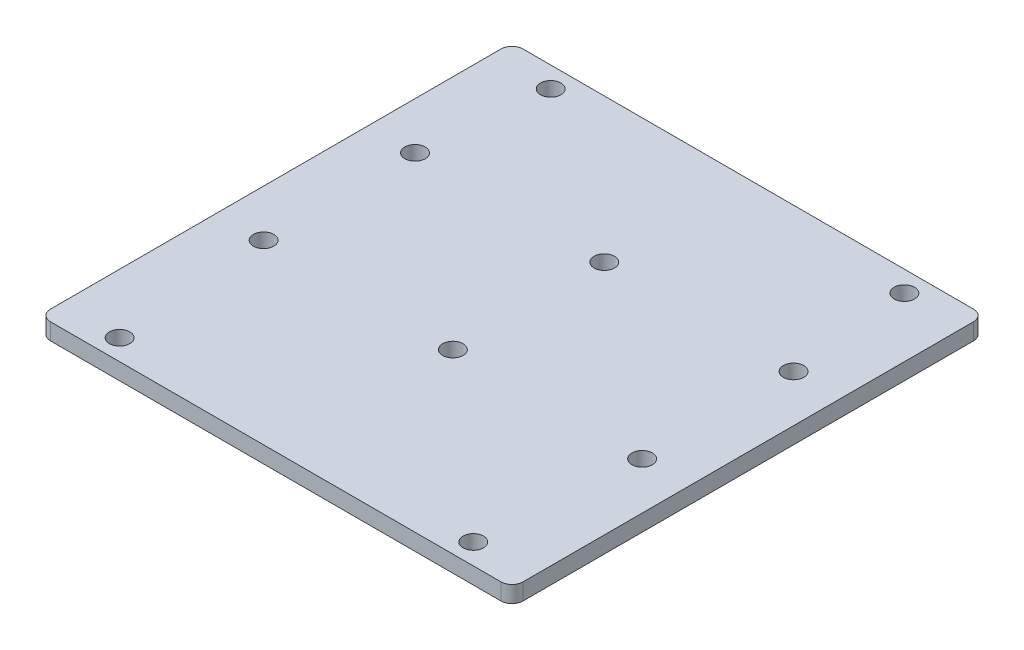
ISO-10303-21;
HEADER;
FILE_DESCRIPTION(('STEP AP214'),'2;1');
FILE_NAME('part.step','',(''),(''),'','','');
FILE_SCHEMA(('AUTOMOTIVE_DESIGN { 1 0 10303 214 1 1 1 1 }'));
ENDSEC;
DATA;
#1=APPLICATION_CONTEXT('core data for automotive mechanical design processes');
#2=APPLICATION_PROTOCOL_DEFINITION('international standard','automotive_design',2000,#1);
#3=PRODUCT_CONTEXT('',#1,'mechanical');
#4=PRODUCT('Part','Part','',(#3));
#5=PRODUCT_RELATED_PRODUCT_CATEGORY('part','',(#4));
#6=PRODUCT_DEFINITION_FORMATION('','',#4);
#7=PRODUCT_DEFINITION_CONTEXT('part definition',#1,'design');
#8=PRODUCT_DEFINITION('design','',#6,#7);
#9=PRODUCT_DEFINITION_SHAPE('','',#8);
#10=(LENGTH_UNIT() NAMED_UNIT(*) SI_UNIT(.MILLI.,.METRE.));
#11=(NAMED_UNIT(*) PLANE_ANGLE_UNIT() SI_UNIT($,.RADIAN.));
#12=(NAMED_UNIT(*) SI_UNIT($,.STERADIAN.) SOLID_ANGLE_UNIT());
#13=UNCERTAINTY_MEASURE_WITH_UNIT(LENGTH_MEASURE(1.E-05),#10,'distance_accuracy_value','');
#14=(GEOMETRIC_REPRESENTATION_CONTEXT(3) GLOBAL_UNCERTAINTY_ASSIGNED_CONTEXT((#13)) GLOBAL_UNIT_ASSIGNED_CONTEXT((#10,
#11,#12)) REPRESENTATION_CONTEXT('',''));
#15=CARTESIAN_POINT('',(0.,0.,0.));
#16=DIRECTION('',(0.,0.,1.));
#17=DIRECTION('',(1.,0.,0.));
#18=AXIS2_PLACEMENT_3D('',#15,#16,#17);
#19=CARTESIAN_POINT('',(-42.75,3.,42.75));
#20=DIRECTION('',(1.,0.,0.));
#21=DIRECTION('',(0.,0.,-1.));
#22=AXIS2_PLACEMENT_3D('',#19,#20,#21);
#23=PLANE('',#22);
#24=DIRECTION('',(0.,0.,1.));
#25=VECTOR('',#24,1.);
#26=CARTESIAN_POINT('',(-42.75,3.,42.75));
#27=LINE('',#26,#25);
#28=CARTESIAN_POINT('',(-42.75,3.,-40.75));
#29=VERTEX_POINT('',#28);
#30=CARTESIAN_POINT('',(-42.75,3.,40.75));
#31=VERTEX_POINT('',#30);
#32=EDGE_CURVE('E122',#29,#31,#27,.T.);
#33=ORIENTED_EDGE('',*,*,#32,.F.);
#34=DIRECTION('',(0.,-1.,0.));
#35=VECTOR('',#34,1.);
#36=CARTESIAN_POINT('',(-42.75,3.,-40.75));
#37=LINE('',#36,#35);
#38=CARTESIAN_POINT('',(-42.75,0.,-40.75));
#39=VERTEX_POINT('',#38);
#40=EDGE_CURVE('E107',#29,#39,#37,.T.);
#41=ORIENTED_EDGE('',*,*,#40,.T.);
#42=DIRECTION('',(0.,0.,1.));
#43=VECTOR('',#42,1.);
#44=CARTESIAN_POINT('',(-42.75,0.,42.75));
#45=LINE('',#44,#43);
#46=CARTESIAN_POINT('',(-42.75,0.,40.75));
#47=VERTEX_POINT('',#46);
#48=EDGE_CURVE('E119',#39,#47,#45,.T.);
#49=ORIENTED_EDGE('',*,*,#48,.T.);
#50=DIRECTION('',(0.,-1.,0.));
#51=VECTOR('',#50,1.);
#52=CARTESIAN_POINT('',(-42.75,3.,40.75));
#53=LINE('',#52,#51);
#54=EDGE_CURVE('E124',#47,#31,#53,.F.);
#55=ORIENTED_EDGE('',*,*,#54,.T.);
#56=EDGE_LOOP('',(#33,#41,#49,#55));
#57=FACE_BOUND('',#56,.T.);
#58=ADVANCED_FACE('F36',(#57),#23,.F.);
#59=CARTESIAN_POINT('',(42.75,3.,42.75));
#60=DIRECTION('',(0.,0.,-1.));
#61=DIRECTION('',(-1.,0.,0.));
#62=AXIS2_PLACEMENT_3D('',#59,#60,#61);
#63=PLANE('',#62);
#64=DIRECTION('',(1.,0.,0.));
#65=VECTOR('',#64,1.);
#66=CARTESIAN_POINT('',(42.75,3.,42.75));
#67=LINE('',#66,#65);
#68=CARTESIAN_POINT('',(-40.75,3.,42.75));
#69=VERTEX_POINT('',#68);
#70=CARTESIAN_POINT('',(40.75,3.,42.75));
#71=VERTEX_POINT('',#70);
#72=EDGE_CURVE('E166',#69,#71,#67,.T.);
#73=ORIENTED_EDGE('',*,*,#72,.F.);
#74=DIRECTION('',(0.,-1.,0.));
#75=VECTOR('',#74,1.);
#76=CARTESIAN_POINT('',(-40.75,3.,42.75));
#77=LINE('',#76,#75);
#78=CARTESIAN_POINT('',(-40.75,0.,42.75));
#79=VERTEX_POINT('',#78);
#80=EDGE_CURVE('E11',#69,#79,#77,.T.);
#81=ORIENTED_EDGE('',*,*,#80,.T.);
#82=DIRECTION('',(1.,0.,0.));
#83=VECTOR('',#82,1.);
#84=CARTESIAN_POINT('',(42.75,0.,42.75));
#85=LINE('',#84,#83);
#86=CARTESIAN_POINT('',(40.75,0.,42.75));
#87=VERTEX_POINT('',#86);
#88=EDGE_CURVE('E129',#79,#87,#85,.T.);
#89=ORIENTED_EDGE('',*,*,#88,.T.);
#90=DIRECTION('',(0.,-1.,0.));
#91=VECTOR('',#90,1.);
#92=CARTESIAN_POINT('',(40.75,3.,42.75));
#93=LINE('',#92,#91);
#94=EDGE_CURVE('E44',#87,#71,#93,.F.);
#95=ORIENTED_EDGE('',*,*,#94,.T.);
#96=EDGE_LOOP('',(#73,#81,#89,#95));
#97=FACE_BOUND('',#96,.T.);
#98=ADVANCED_FACE('F165',(#97),#63,.F.);
#99=CARTESIAN_POINT('',(42.75,3.,42.75));
#100=DIRECTION('',(-1.,0.,0.));
#101=DIRECTION('',(0.,0.,1.));
#102=AXIS2_PLACEMENT_3D('',#99,#100,#101);
#103=PLANE('',#102);
#104=DIRECTION('',(0.,0.,-1.));
#105=VECTOR('',#104,1.);
#106=CARTESIAN_POINT('',(42.75,0.,42.75));
#107=LINE('',#106,#105);
#108=CARTESIAN_POINT('',(42.75,0.,40.75));
#109=VERTEX_POINT('',#108);
#110=CARTESIAN_POINT('',(42.75,0.,-40.75));
#111=VERTEX_POINT('',#110);
#112=EDGE_CURVE('E133',#109,#111,#107,.T.);
#113=ORIENTED_EDGE('',*,*,#112,.T.);
#114=DIRECTION('',(0.,-1.,0.));
#115=VECTOR('',#114,1.);
#116=CARTESIAN_POINT('',(42.75,3.,-40.75));
#117=LINE('',#116,#115);
#118=CARTESIAN_POINT('',(42.75,3.,-40.75));
#119=VERTEX_POINT('',#118);
#120=EDGE_CURVE('E51',#111,#119,#117,.F.);
#121=ORIENTED_EDGE('',*,*,#120,.T.);
#122=DIRECTION('',(0.,0.,-1.));
#123=VECTOR('',#122,1.);
#124=CARTESIAN_POINT('',(42.75,3.,42.75));
#125=LINE('',#124,#123);
#126=CARTESIAN_POINT('',(42.75,3.,40.75));
#127=VERTEX_POINT('',#126);
#128=EDGE_CURVE('E172',#127,#119,#125,.T.);
#129=ORIENTED_EDGE('',*,*,#128,.F.);
#130=DIRECTION('',(0.,-1.,0.));
#131=VECTOR('',#130,1.);
#132=CARTESIAN_POINT('',(42.75,3.,40.75));
#133=LINE('',#132,#131);
#134=EDGE_CURVE('E159',#127,#109,#133,.T.);
#135=ORIENTED_EDGE('',*,*,#134,.T.);
#136=EDGE_LOOP('',(#113,#121,#129,#135));
#137=FACE_BOUND('',#136,.T.);
#138=ADVANCED_FACE('F176',(#137),#103,.F.);
#139=CARTESIAN_POINT('',(42.75,3.,-42.75));
#140=DIRECTION('',(0.,0.,1.));
#141=DIRECTION('',(1.,0.,0.));
#142=AXIS2_PLACEMENT_3D('',#139,#140,#141);
#143=PLANE('',#142);
#144=DIRECTION('',(-1.,0.,0.));
#145=VECTOR('',#144,1.);
#146=CARTESIAN_POINT('',(42.75,0.,-42.75));
#147=LINE('',#146,#145);
#148=CARTESIAN_POINT('',(40.75,0.,-42.75));
#149=VERTEX_POINT('',#148);
#150=CARTESIAN_POINT('',(-40.75,0.,-42.75));
#151=VERTEX_POINT('',#150);
#152=EDGE_CURVE('E143',#149,#151,#147,.T.);
#153=ORIENTED_EDGE('',*,*,#152,.T.);
#154=DIRECTION('',(0.,-1.,0.));
#155=VECTOR('',#154,1.);
#156=CARTESIAN_POINT('',(-40.75,3.,-42.75));
#157=LINE('',#156,#155);
#158=CARTESIAN_POINT('',(-40.75,3.,-42.75));
#159=VERTEX_POINT('',#158);
#160=EDGE_CURVE('E108',#151,#159,#157,.F.);
#161=ORIENTED_EDGE('',*,*,#160,.T.);
#162=DIRECTION('',(-1.,0.,0.));
#163=VECTOR('',#162,1.);
#164=CARTESIAN_POINT('',(42.75,3.,-42.75));
#165=LINE('',#164,#163);
#166=CARTESIAN_POINT('',(40.75,3.,-42.75));
#167=VERTEX_POINT('',#166);
#168=EDGE_CURVE('E139',#167,#159,#165,.T.);
#169=ORIENTED_EDGE('',*,*,#168,.F.);
#170=DIRECTION('',(0.,-1.,0.));
#171=VECTOR('',#170,1.);
#172=CARTESIAN_POINT('',(40.75,3.,-42.75));
#173=LINE('',#172,#171);
#174=EDGE_CURVE('E113',#167,#149,#173,.T.);
#175=ORIENTED_EDGE('',*,*,#174,.T.);
#176=EDGE_LOOP('',(#153,#161,#169,#175));
#177=FACE_BOUND('',#176,.T.);
#178=ADVANCED_FACE('F183',(#177),#143,.F.);
#179=CARTESIAN_POINT('',(0.,3.,0.));
#180=DIRECTION('',(0.,1.,0.));
#181=DIRECTION('',(0.,0.,1.));
#182=AXIS2_PLACEMENT_3D('',#179,#180,#181);
#183=PLANE('',#182);
#184=CARTESIAN_POINT('',(0.,3.,-16.7));
#185=DIRECTION('',(0.,1.,0.));
#186=DIRECTION('',(0.,0.,1.));
#187=AXIS2_PLACEMENT_3D('',#184,#185,#186);
#188=CIRCLE('',#187,1.85);
#189=CARTESIAN_POINT('',(0.,3.,-14.85));
#190=VERTEX_POINT('',#189);
#191=EDGE_CURVE('E206',#190,#190,#188,.T.);
#192=ORIENTED_EDGE('',*,*,#191,.F.);
#193=EDGE_LOOP('',(#192));
#194=FACE_BOUND('',#193,.T.);
#195=CARTESIAN_POINT('',(34.2499999999999,3.,-16.7));
#196=DIRECTION('',(0.,1.,0.));
#197=DIRECTION('',(0.,0.,1.));
#198=AXIS2_PLACEMENT_3D('',#195,#196,#197);
#199=CIRCLE('',#198,1.85);
#200=CARTESIAN_POINT('',(34.2499999999999,3.,-14.85));
#201=VERTEX_POINT('',#200);
#202=EDGE_CURVE('E209',#201,#201,#199,.T.);
#203=ORIENTED_EDGE('',*,*,#202,.F.);
#204=EDGE_LOOP('',(#203));
#205=FACE_BOUND('',#204,.T.);
#206=CARTESIAN_POINT('',(0.,3.,10.7));
#207=DIRECTION('',(0.,1.,0.));
#208=DIRECTION('',(0.,0.,1.));
#209=AXIS2_PLACEMENT_3D('',#206,#207,#208);
#210=CIRCLE('',#209,1.85);
#211=CARTESIAN_POINT('',(0.,3.,12.55));
#212=VERTEX_POINT('',#211);
#213=EDGE_CURVE('E212',#212,#212,#210,.T.);
#214=ORIENTED_EDGE('',*,*,#213,.F.);
#215=EDGE_LOOP('',(#214));
#216=FACE_BOUND('',#215,.T.);
#217=CARTESIAN_POINT('',(-34.25,3.,10.7));
#218=DIRECTION('',(0.,1.,0.));
#219=DIRECTION('',(0.,0.,1.));
#220=AXIS2_PLACEMENT_3D('',#217,#218,#219);
#221=CIRCLE('',#220,1.85);
#222=CARTESIAN_POINT('',(-34.25,3.,12.55));
#223=VERTEX_POINT('',#222);
#224=EDGE_CURVE('E215',#223,#223,#221,.T.);
#225=ORIENTED_EDGE('',*,*,#224,.F.);
#226=EDGE_LOOP('',(#225));
#227=FACE_BOUND('',#226,.T.);
#228=CARTESIAN_POINT('',(34.2499999999999,3.,10.7));
#229=DIRECTION('',(0.,1.,0.));
#230=DIRECTION('',(0.,0.,1.));
#231=AXIS2_PLACEMENT_3D('',#228,#229,#230);
#232=CIRCLE('',#231,1.85);
#233=CARTESIAN_POINT('',(34.2499999999999,3.,12.55));
#234=VERTEX_POINT('',#233);
#235=EDGE_CURVE('E218',#234,#234,#232,.T.);
#236=ORIENTED_EDGE('',*,*,#235,.F.);
#237=EDGE_LOOP('',(#236));
#238=FACE_BOUND('',#237,.T.);
#239=CARTESIAN_POINT('',(-34.25,3.,-16.6999999999999));
#240=DIRECTION('',(0.,1.,0.));
#241=DIRECTION('',(0.,0.,1.));
#242=AXIS2_PLACEMENT_3D('',#239,#240,#241);
#243=CIRCLE('',#242,1.85);
#244=CARTESIAN_POINT('',(-34.25,3.,-14.8499999999999));
#245=VERTEX_POINT('',#244);
#246=EDGE_CURVE('E221',#245,#245,#243,.T.);
#247=ORIENTED_EDGE('',*,*,#246,.F.);
#248=EDGE_LOOP('',(#247));
#249=FACE_BOUND('',#248,.T.);
#250=CARTESIAN_POINT('',(31.9999999999999,3.,38.9999999999999));
#251=DIRECTION('',(0.,1.,0.));
#252=DIRECTION('',(0.,0.,1.));
#253=AXIS2_PLACEMENT_3D('',#250,#251,#252);
#254=CIRCLE('',#253,1.85);
#255=CARTESIAN_POINT('',(31.9999999999999,3.,40.8499999999999));
#256=VERTEX_POINT('',#255);
#257=EDGE_CURVE('E130',#256,#256,#254,.T.);
#258=ORIENTED_EDGE('',*,*,#257,.F.);
#259=EDGE_LOOP('',(#258));
#260=FACE_BOUND('',#259,.T.);
#261=CARTESIAN_POINT('',(-32.,3.,-39.));
#262=DIRECTION('',(0.,1.,0.));
#263=DIRECTION('',(0.,0.,1.));
#264=AXIS2_PLACEMENT_3D('',#261,#262,#263);
#265=CIRCLE('',#264,1.85);
#266=CARTESIAN_POINT('',(-32.,3.,-37.15));
#267=VERTEX_POINT('',#266);
#268=EDGE_CURVE('E136',#267,#267,#265,.T.);
#269=ORIENTED_EDGE('',*,*,#268,.F.);
#270=EDGE_LOOP('',(#269));
#271=FACE_BOUND('',#270,.T.);
#272=CARTESIAN_POINT('',(32.,3.,-39.));
#273=DIRECTION('',(0.,1.,0.));
#274=DIRECTION('',(0.,0.,1.));
#275=AXIS2_PLACEMENT_3D('',#272,#273,#274);
#276=CIRCLE('',#275,1.85);
#277=CARTESIAN_POINT('',(32.,3.,-37.15));
#278=VERTEX_POINT('',#277);
#279=EDGE_CURVE('E188',#278,#278,#276,.T.);
#280=ORIENTED_EDGE('',*,*,#279,.F.);
#281=EDGE_LOOP('',(#280));
#282=FACE_BOUND('',#281,.T.);
#283=CARTESIAN_POINT('',(-32.0000000000001,3.,39.));
#284=DIRECTION('',(0.,1.,0.));
#285=DIRECTION('',(0.,0.,1.));
#286=AXIS2_PLACEMENT_3D('',#283,#284,#285);
#287=CIRCLE('',#286,1.85);
#288=CARTESIAN_POINT('',(-32.0000000000001,3.,40.85));
#289=VERTEX_POINT('',#288);
#290=EDGE_CURVE('E191',#289,#289,#287,.T.);
#291=ORIENTED_EDGE('',*,*,#290,.F.);
#292=EDGE_LOOP('',(#291));
#293=FACE_BOUND('',#292,.T.);
#294=ORIENTED_EDGE('',*,*,#168,.T.);
#295=CARTESIAN_POINT('',(-40.75,3.,-40.75));
#296=DIRECTION('',(0.,1.,0.));
#297=DIRECTION('',(0.,0.,1.));
#298=AXIS2_PLACEMENT_3D('',#295,#296,#297);
#299=CIRCLE('',#298,2.);
#300=EDGE_CURVE('E157',#159,#29,#299,.T.);
#301=ORIENTED_EDGE('',*,*,#300,.T.);
#302=ORIENTED_EDGE('',*,*,#32,.T.);
#303=CARTESIAN_POINT('',(-40.75,3.,40.75));
#304=DIRECTION('',(0.,1.,0.));
#305=DIRECTION('',(0.,0.,1.));
#306=AXIS2_PLACEMENT_3D('',#303,#304,#305);
#307=CIRCLE('',#306,2.);
#308=EDGE_CURVE('E153',#31,#69,#307,.T.);
#309=ORIENTED_EDGE('',*,*,#308,.T.);
#310=ORIENTED_EDGE('',*,*,#72,.T.);
#311=CARTESIAN_POINT('',(40.75,3.,40.75));
#312=DIRECTION('',(0.,1.,0.));
#313=DIRECTION('',(0.,0.,1.));
#314=AXIS2_PLACEMENT_3D('',#311,#312,#313);
#315=CIRCLE('',#314,2.);
#316=EDGE_CURVE('E58',#71,#127,#315,.T.);
#317=ORIENTED_EDGE('',*,*,#316,.T.);
#318=ORIENTED_EDGE('',*,*,#128,.T.);
#319=CARTESIAN_POINT('',(40.75,3.,-40.75));
#320=DIRECTION('',(0.,1.,0.));
#321=DIRECTION('',(0.,0.,1.));
#322=AXIS2_PLACEMENT_3D('',#319,#320,#321);
#323=CIRCLE('',#322,2.);
#324=EDGE_CURVE('E155',#119,#167,#323,.T.);
#325=ORIENTED_EDGE('',*,*,#324,.T.);
#326=EDGE_LOOP('',(#294,#301,#302,#309,#310,#317,#318,#325));
#327=FACE_BOUND('',#326,.T.);
#328=ADVANCED_FACE('F170',(#194,#205,#216,#227,#238,#249,#260,#271,#282,#293,#327),#183,.T.);
#329=CARTESIAN_POINT('',(0.,0.,0.));
#330=DIRECTION('',(0.,1.,0.));
#331=DIRECTION('',(0.,0.,1.));
#332=AXIS2_PLACEMENT_3D('',#329,#330,#331);
#333=PLANE('',#332);
#334=CARTESIAN_POINT('',(0.,0.,-16.7));
#335=DIRECTION('',(0.,-1.,0.));
#336=DIRECTION('',(0.,0.,-1.));
#337=AXIS2_PLACEMENT_3D('',#334,#335,#336);
#338=CIRCLE('',#337,1.85);
#339=CARTESIAN_POINT('',(0.,0.,-18.55));
#340=VERTEX_POINT('',#339);
#341=EDGE_CURVE('E227',#340,#340,#338,.T.);
#342=ORIENTED_EDGE('',*,*,#341,.F.);
#343=EDGE_LOOP('',(#342));
#344=FACE_BOUND('',#343,.T.);
#345=CARTESIAN_POINT('',(34.2499999999999,0.,-16.7));
#346=DIRECTION('',(0.,-1.,0.));
#347=DIRECTION('',(0.,0.,-1.));
#348=AXIS2_PLACEMENT_3D('',#345,#346,#347);
#349=CIRCLE('',#348,1.85);
#350=CARTESIAN_POINT('',(34.2499999999999,0.,-18.55));
#351=VERTEX_POINT('',#350);
#352=EDGE_CURVE('E235',#351,#351,#349,.T.);
#353=ORIENTED_EDGE('',*,*,#352,.F.);
#354=EDGE_LOOP('',(#353));
#355=FACE_BOUND('',#354,.T.);
#356=CARTESIAN_POINT('',(0.,0.,10.7));
#357=DIRECTION('',(0.,-1.,0.));
#358=DIRECTION('',(0.,0.,-1.));
#359=AXIS2_PLACEMENT_3D('',#356,#357,#358);
#360=CIRCLE('',#359,1.85);
#361=CARTESIAN_POINT('',(0.,0.,8.85000000000004));
#362=VERTEX_POINT('',#361);
#363=EDGE_CURVE('E231',#362,#362,#360,.T.);
#364=ORIENTED_EDGE('',*,*,#363,.F.);
#365=EDGE_LOOP('',(#364));
#366=FACE_BOUND('',#365,.T.);
#367=CARTESIAN_POINT('',(-34.25,0.,10.7));
#368=DIRECTION('',(0.,-1.,0.));
#369=DIRECTION('',(0.,0.,-1.));
#370=AXIS2_PLACEMENT_3D('',#367,#368,#369);
#371=CIRCLE('',#370,1.85);
#372=CARTESIAN_POINT('',(-34.25,0.,8.85000000000005));
#373=VERTEX_POINT('',#372);
#374=EDGE_CURVE('E228',#373,#373,#371,.T.);
#375=ORIENTED_EDGE('',*,*,#374,.F.);
#376=EDGE_LOOP('',(#375));
#377=FACE_BOUND('',#376,.T.);
#378=CARTESIAN_POINT('',(34.2499999999999,0.,10.7));
#379=DIRECTION('',(0.,-1.,0.));
#380=DIRECTION('',(0.,0.,-1.));
#381=AXIS2_PLACEMENT_3D('',#378,#379,#380);
#382=CIRCLE('',#381,1.85);
#383=CARTESIAN_POINT('',(34.2499999999999,0.,8.85000000000002));
#384=VERTEX_POINT('',#383);
#385=EDGE_CURVE('E232',#384,#384,#382,.T.);
#386=ORIENTED_EDGE('',*,*,#385,.F.);
#387=EDGE_LOOP('',(#386));
#388=FACE_BOUND('',#387,.T.);
#389=CARTESIAN_POINT('',(-34.25,0.,-16.6999999999999));
#390=DIRECTION('',(0.,-1.,0.));
#391=DIRECTION('',(0.,0.,-1.));
#392=AXIS2_PLACEMENT_3D('',#389,#390,#391);
#393=CIRCLE('',#392,1.85);
#394=CARTESIAN_POINT('',(-34.25,0.,-18.5499999999999));
#395=VERTEX_POINT('',#394);
#396=EDGE_CURVE('E224',#395,#395,#393,.T.);
#397=ORIENTED_EDGE('',*,*,#396,.F.);
#398=EDGE_LOOP('',(#397));
#399=FACE_BOUND('',#398,.T.);
#400=CARTESIAN_POINT('',(31.9999999999999,0.,38.9999999999999));
#401=DIRECTION('',(0.,-1.,0.));
#402=DIRECTION('',(0.,0.,-1.));
#403=AXIS2_PLACEMENT_3D('',#400,#401,#402);
#404=CIRCLE('',#403,1.85);
#405=CARTESIAN_POINT('',(31.9999999999999,0.,37.1499999999999));
#406=VERTEX_POINT('',#405);
#407=EDGE_CURVE('E197',#406,#406,#404,.T.);
#408=ORIENTED_EDGE('',*,*,#407,.F.);
#409=EDGE_LOOP('',(#408));
#410=FACE_BOUND('',#409,.T.);
#411=CARTESIAN_POINT('',(-32.,0.,-39.));
#412=DIRECTION('',(0.,-1.,0.));
#413=DIRECTION('',(0.,0.,-1.));
#414=AXIS2_PLACEMENT_3D('',#411,#412,#413);
#415=CIRCLE('',#414,1.85);
#416=CARTESIAN_POINT('',(-32.,0.,-40.85));
#417=VERTEX_POINT('',#416);
#418=EDGE_CURVE('E198',#417,#417,#415,.T.);
#419=ORIENTED_EDGE('',*,*,#418,.F.);
#420=EDGE_LOOP('',(#419));
#421=FACE_BOUND('',#420,.T.);
#422=CARTESIAN_POINT('',(32.,0.,-39.));
#423=DIRECTION('',(0.,-1.,0.));
#424=DIRECTION('',(0.,0.,-1.));
#425=AXIS2_PLACEMENT_3D('',#422,#423,#424);
#426=CIRCLE('',#425,1.85);
#427=CARTESIAN_POINT('',(32.,0.,-40.85));
#428=VERTEX_POINT('',#427);
#429=EDGE_CURVE('E201',#428,#428,#426,.T.);
#430=ORIENTED_EDGE('',*,*,#429,.F.);
#431=EDGE_LOOP('',(#430));
#432=FACE_BOUND('',#431,.T.);
#433=CARTESIAN_POINT('',(-32.0000000000001,0.,39.));
#434=DIRECTION('',(0.,-1.,0.));
#435=DIRECTION('',(0.,0.,-1.));
#436=AXIS2_PLACEMENT_3D('',#433,#434,#435);
#437=CIRCLE('',#436,1.85);
#438=CARTESIAN_POINT('',(-32.0000000000001,0.,37.15));
#439=VERTEX_POINT('',#438);
#440=EDGE_CURVE('E194',#439,#439,#437,.T.);
#441=ORIENTED_EDGE('',*,*,#440,.F.);
#442=EDGE_LOOP('',(#441));
#443=FACE_BOUND('',#442,.T.);
#444=ORIENTED_EDGE('',*,*,#48,.F.);
#445=CARTESIAN_POINT('',(-40.75,0.,-40.75));
#446=DIRECTION('',(0.,1.,0.));
#447=DIRECTION('',(0.,0.,1.));
#448=AXIS2_PLACEMENT_3D('',#445,#446,#447);
#449=CIRCLE('',#448,2.);
#450=EDGE_CURVE('E103',#39,#151,#449,.F.);
#451=ORIENTED_EDGE('',*,*,#450,.T.);
#452=ORIENTED_EDGE('',*,*,#152,.F.);
#453=CARTESIAN_POINT('',(40.75,0.,-40.75));
#454=DIRECTION('',(0.,1.,0.));
#455=DIRECTION('',(0.,0.,1.));
#456=AXIS2_PLACEMENT_3D('',#453,#454,#455);
#457=CIRCLE('',#456,2.);
#458=EDGE_CURVE('E114',#149,#111,#457,.F.);
#459=ORIENTED_EDGE('',*,*,#458,.T.);
#460=ORIENTED_EDGE('',*,*,#112,.F.);
#461=CARTESIAN_POINT('',(40.75,0.,40.75));
#462=DIRECTION('',(0.,1.,0.));
#463=DIRECTION('',(0.,0.,1.));
#464=AXIS2_PLACEMENT_3D('',#461,#462,#463);
#465=CIRCLE('',#464,2.);
#466=EDGE_CURVE('E123',#109,#87,#465,.F.);
#467=ORIENTED_EDGE('',*,*,#466,.T.);
#468=ORIENTED_EDGE('',*,*,#88,.F.);
#469=CARTESIAN_POINT('',(-40.75,0.,40.75));
#470=DIRECTION('',(0.,1.,0.));
#471=DIRECTION('',(0.,0.,1.));
#472=AXIS2_PLACEMENT_3D('',#469,#470,#471);
#473=CIRCLE('',#472,2.);
#474=EDGE_CURVE('E128',#79,#47,#473,.F.);
#475=ORIENTED_EDGE('',*,*,#474,.T.);
#476=EDGE_LOOP('',(#444,#451,#452,#459,#460,#467,#468,#475));
#477=FACE_BOUND('',#476,.T.);
#478=ADVANCED_FACE('F126',(#344,#355,#366,#377,#388,#399,#410,#421,#432,#443,#477),#333,.F.);
#479=CARTESIAN_POINT('',(-40.75,3.,-40.75));
#480=DIRECTION('',(0.,-1.,0.));
#481=DIRECTION('',(0.,0.,-1.));
#482=AXIS2_PLACEMENT_3D('',#479,#480,#481);
#483=CYLINDRICAL_SURFACE('',#482,2.);
#484=ORIENTED_EDGE('',*,*,#300,.F.);
#485=ORIENTED_EDGE('',*,*,#160,.F.);
#486=ORIENTED_EDGE('',*,*,#450,.F.);
#487=ORIENTED_EDGE('',*,*,#40,.F.);
#488=EDGE_LOOP('',(#484,#485,#486,#487));
#489=FACE_BOUND('',#488,.T.);
#490=ADVANCED_FACE('F106',(#489),#483,.T.);
#491=CARTESIAN_POINT('',(40.75,3.,-40.75));
#492=DIRECTION('',(0.,-1.,0.));
#493=DIRECTION('',(0.,0.,-1.));
#494=AXIS2_PLACEMENT_3D('',#491,#492,#493);
#495=CYLINDRICAL_SURFACE('',#494,2.);
#496=ORIENTED_EDGE('',*,*,#324,.F.);
#497=ORIENTED_EDGE('',*,*,#120,.F.);
#498=ORIENTED_EDGE('',*,*,#458,.F.);
#499=ORIENTED_EDGE('',*,*,#174,.F.);
#500=EDGE_LOOP('',(#496,#497,#498,#499));
#501=FACE_BOUND('',#500,.T.);
#502=ADVANCED_FACE('F180',(#501),#495,.T.);
#503=CARTESIAN_POINT('',(-40.75,3.,40.75));
#504=DIRECTION('',(0.,-1.,0.));
#505=DIRECTION('',(0.,0.,-1.));
#506=AXIS2_PLACEMENT_3D('',#503,#504,#505);
#507=CYLINDRICAL_SURFACE('',#506,2.);
#508=ORIENTED_EDGE('',*,*,#308,.F.);
#509=ORIENTED_EDGE('',*,*,#54,.F.);
#510=ORIENTED_EDGE('',*,*,#474,.F.);
#511=ORIENTED_EDGE('',*,*,#80,.F.);
#512=EDGE_LOOP('',(#508,#509,#510,#511));
#513=FACE_BOUND('',#512,.T.);
#514=ADVANCED_FACE('F271',(#513),#507,.T.);
#515=CARTESIAN_POINT('',(40.75,3.,40.75));
#516=DIRECTION('',(0.,-1.,0.));
#517=DIRECTION('',(0.,0.,-1.));
#518=AXIS2_PLACEMENT_3D('',#515,#516,#517);
#519=CYLINDRICAL_SURFACE('',#518,2.);
#520=ORIENTED_EDGE('',*,*,#316,.F.);
#521=ORIENTED_EDGE('',*,*,#94,.F.);
#522=ORIENTED_EDGE('',*,*,#466,.F.);
#523=ORIENTED_EDGE('',*,*,#134,.F.);
#524=EDGE_LOOP('',(#520,#521,#522,#523));
#525=FACE_BOUND('',#524,.T.);
#526=ADVANCED_FACE('F38',(#525),#519,.T.);
#527=CARTESIAN_POINT('',(-32.0000000000001,10.,39.));
#528=DIRECTION('',(0.,-1.,0.));
#529=DIRECTION('',(0.,0.,-1.));
#530=AXIS2_PLACEMENT_3D('',#527,#528,#529);
#531=CYLINDRICAL_SURFACE('',#530,1.85);
#532=ORIENTED_EDGE('',*,*,#290,.T.);
#533=EDGE_LOOP('',(#532));
#534=FACE_BOUND('',#533,.T.);
#535=ORIENTED_EDGE('',*,*,#440,.T.);
#536=EDGE_LOOP('',(#535));
#537=FACE_BOUND('',#536,.T.);
#538=ADVANCED_FACE('F259',(#534,#537),#531,.F.);
#539=CARTESIAN_POINT('',(32.,10.,-39.));
#540=DIRECTION('',(0.,-1.,0.));
#541=DIRECTION('',(0.,0.,-1.));
#542=AXIS2_PLACEMENT_3D('',#539,#540,#541);
#543=CYLINDRICAL_SURFACE('',#542,1.85);
#544=ORIENTED_EDGE('',*,*,#279,.T.);
#545=EDGE_LOOP('',(#544));
#546=FACE_BOUND('',#545,.T.);
#547=ORIENTED_EDGE('',*,*,#429,.T.);
#548=EDGE_LOOP('',(#547));
#549=FACE_BOUND('',#548,.T.);
#550=ADVANCED_FACE('F261',(#546,#549),#543,.F.);
#551=CARTESIAN_POINT('',(-32.,10.,-39.));
#552=DIRECTION('',(0.,-1.,0.));
#553=DIRECTION('',(0.,0.,-1.));
#554=AXIS2_PLACEMENT_3D('',#551,#552,#553);
#555=CYLINDRICAL_SURFACE('',#554,1.85);
#556=ORIENTED_EDGE('',*,*,#268,.T.);
#557=EDGE_LOOP('',(#556));
#558=FACE_BOUND('',#557,.T.);
#559=ORIENTED_EDGE('',*,*,#418,.T.);
#560=EDGE_LOOP('',(#559));
#561=FACE_BOUND('',#560,.T.);
#562=ADVANCED_FACE('F268',(#558,#561),#555,.F.);
#563=CARTESIAN_POINT('',(31.9999999999999,10.,38.9999999999999));
#564=DIRECTION('',(0.,-1.,0.));
#565=DIRECTION('',(0.,0.,-1.));
#566=AXIS2_PLACEMENT_3D('',#563,#564,#565);
#567=CYLINDRICAL_SURFACE('',#566,1.85);
#568=ORIENTED_EDGE('',*,*,#257,.T.);
#569=EDGE_LOOP('',(#568));
#570=FACE_BOUND('',#569,.T.);
#571=ORIENTED_EDGE('',*,*,#407,.T.);
#572=EDGE_LOOP('',(#571));
#573=FACE_BOUND('',#572,.T.);
#574=ADVANCED_FACE('F317',(#570,#573),#567,.F.);
#575=CARTESIAN_POINT('',(-34.25,5.,-16.6999999999999));
#576=DIRECTION('',(0.,-1.,0.));
#577=DIRECTION('',(0.,0.,-1.));
#578=AXIS2_PLACEMENT_3D('',#575,#576,#577);
#579=CYLINDRICAL_SURFACE('',#578,1.85);
#580=ORIENTED_EDGE('',*,*,#246,.T.);
#581=EDGE_LOOP('',(#580));
#582=FACE_BOUND('',#581,.T.);
#583=ORIENTED_EDGE('',*,*,#396,.T.);
#584=EDGE_LOOP('',(#583));
#585=FACE_BOUND('',#584,.T.);
#586=ADVANCED_FACE('F327',(#582,#585),#579,.F.);
#587=CARTESIAN_POINT('',(34.2499999999999,5.,10.7));
#588=DIRECTION('',(0.,-1.,0.));
#589=DIRECTION('',(0.,0.,-1.));
#590=AXIS2_PLACEMENT_3D('',#587,#588,#589);
#591=CYLINDRICAL_SURFACE('',#590,1.85);
#592=ORIENTED_EDGE('',*,*,#235,.T.);
#593=EDGE_LOOP('',(#592));
#594=FACE_BOUND('',#593,.T.);
#595=ORIENTED_EDGE('',*,*,#385,.T.);
#596=EDGE_LOOP('',(#595));
#597=FACE_BOUND('',#596,.T.);
#598=ADVANCED_FACE('F243',(#594,#597),#591,.F.);
#599=CARTESIAN_POINT('',(-34.25,5.,10.7));
#600=DIRECTION('',(0.,-1.,0.));
#601=DIRECTION('',(0.,0.,-1.));
#602=AXIS2_PLACEMENT_3D('',#599,#600,#601);
#603=CYLINDRICAL_SURFACE('',#602,1.85);
#604=ORIENTED_EDGE('',*,*,#224,.T.);
#605=EDGE_LOOP('',(#604));
#606=FACE_BOUND('',#605,.T.);
#607=ORIENTED_EDGE('',*,*,#374,.T.);
#608=EDGE_LOOP('',(#607));
#609=FACE_BOUND('',#608,.T.);
#610=ADVANCED_FACE('F367',(#606,#609),#603,.F.);
#611=CARTESIAN_POINT('',(0.,5.,10.7));
#612=DIRECTION('',(0.,-1.,0.));
#613=DIRECTION('',(0.,0.,-1.));
#614=AXIS2_PLACEMENT_3D('',#611,#612,#613);
#615=CYLINDRICAL_SURFACE('',#614,1.85);
#616=ORIENTED_EDGE('',*,*,#213,.T.);
#617=EDGE_LOOP('',(#616));
#618=FACE_BOUND('',#617,.T.);
#619=ORIENTED_EDGE('',*,*,#363,.T.);
#620=EDGE_LOOP('',(#619));
#621=FACE_BOUND('',#620,.T.);
#622=ADVANCED_FACE('F378',(#618,#621),#615,.F.);
#623=CARTESIAN_POINT('',(34.2499999999999,5.,-16.7));
#624=DIRECTION('',(0.,-1.,0.));
#625=DIRECTION('',(0.,0.,-1.));
#626=AXIS2_PLACEMENT_3D('',#623,#624,#625);
#627=CYLINDRICAL_SURFACE('',#626,1.85);
#628=ORIENTED_EDGE('',*,*,#202,.T.);
#629=EDGE_LOOP('',(#628));
#630=FACE_BOUND('',#629,.T.);
#631=ORIENTED_EDGE('',*,*,#352,.T.);
#632=EDGE_LOOP('',(#631));
#633=FACE_BOUND('',#632,.T.);
#634=ADVANCED_FACE('F389',(#630,#633),#627,.F.);
#635=CARTESIAN_POINT('',(0.,5.,-16.7));
#636=DIRECTION('',(0.,-1.,0.));
#637=DIRECTION('',(0.,0.,-1.));
#638=AXIS2_PLACEMENT_3D('',#635,#636,#637);
#639=CYLINDRICAL_SURFACE('',#638,1.85);
#640=ORIENTED_EDGE('',*,*,#191,.T.);
#641=EDGE_LOOP('',(#640));
#642=FACE_BOUND('',#641,.T.);
#643=ORIENTED_EDGE('',*,*,#341,.T.);
#644=EDGE_LOOP('',(#643));
#645=FACE_BOUND('',#644,.T.);
#646=ADVANCED_FACE('F400',(#642,#645),#639,.F.);
#647=CLOSED_SHELL('',(#58,#98,#138,#178,#328,#478,#490,#502,#514,#526,#538,#550,#562,#574,#586,
#598,#610,#622,#634,#646));
#648=MANIFOLD_SOLID_BREP('B2',#647);
#649=ADVANCED_BREP_SHAPE_REPRESENTATION('',(#18,#648),#14);
#650=SHAPE_DEFINITION_REPRESENTATION(#9,#649);
ENDSEC;
END-ISO-10303-21;
